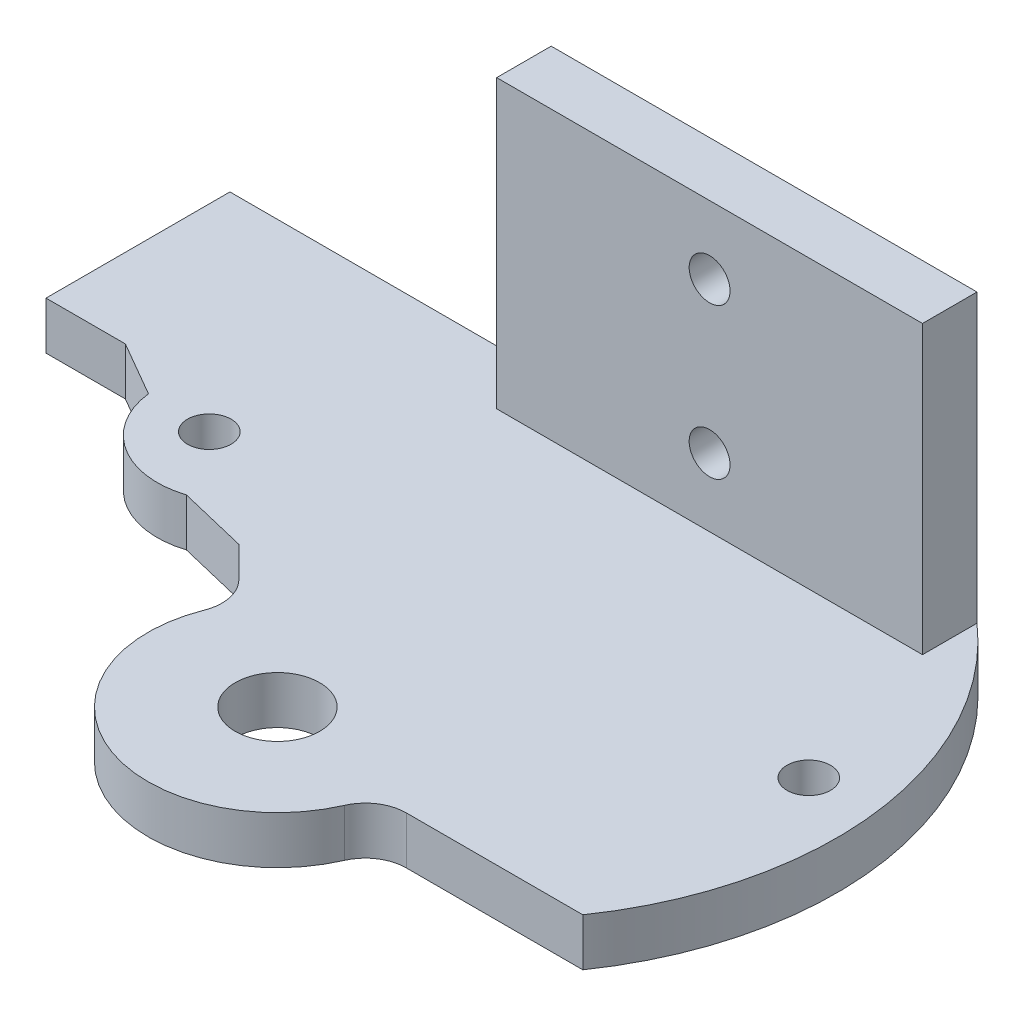
ISO-10303-21;
HEADER;
FILE_DESCRIPTION(('STEP AP214'),'2;1');
FILE_NAME('part.step','',(''),(''),'','','');
FILE_SCHEMA(('AUTOMOTIVE_DESIGN { 1 0 10303 214 1 1 1 1 }'));
ENDSEC;
DATA;
#1=APPLICATION_CONTEXT('core data for automotive mechanical design processes');
#2=APPLICATION_PROTOCOL_DEFINITION('international standard','automotive_design',2000,#1);
#3=PRODUCT_CONTEXT('',#1,'mechanical');
#4=PRODUCT('Part','Part','',(#3));
#5=PRODUCT_RELATED_PRODUCT_CATEGORY('part','',(#4));
#6=PRODUCT_DEFINITION_FORMATION('','',#4);
#7=PRODUCT_DEFINITION_CONTEXT('part definition',#1,'design');
#8=PRODUCT_DEFINITION('design','',#6,#7);
#9=PRODUCT_DEFINITION_SHAPE('','',#8);
#10=(LENGTH_UNIT() NAMED_UNIT(*) SI_UNIT(.MILLI.,.METRE.));
#11=(NAMED_UNIT(*) PLANE_ANGLE_UNIT() SI_UNIT($,.RADIAN.));
#12=(NAMED_UNIT(*) SI_UNIT($,.STERADIAN.) SOLID_ANGLE_UNIT());
#13=UNCERTAINTY_MEASURE_WITH_UNIT(LENGTH_MEASURE(1.E-05),#10,'distance_accuracy_value','');
#14=(GEOMETRIC_REPRESENTATION_CONTEXT(3) GLOBAL_UNCERTAINTY_ASSIGNED_CONTEXT((#13)) GLOBAL_UNIT_ASSIGNED_CONTEXT((#10,
#11,#12)) REPRESENTATION_CONTEXT('',''));
#15=CARTESIAN_POINT('',(0.,0.,0.));
#16=DIRECTION('',(0.,0.,1.));
#17=DIRECTION('',(1.,0.,0.));
#18=AXIS2_PLACEMENT_3D('',#15,#16,#17);
#19=CARTESIAN_POINT('',(20.3496,17.,-13.5));
#20=DIRECTION('',(0.,0.,1.));
#21=DIRECTION('',(1.,0.,0.));
#22=AXIS2_PLACEMENT_3D('',#19,#20,#21);
#23=PLANE('',#22);
#24=CARTESIAN_POINT('',(4.72198433686638,22.,-13.5));
#25=DIRECTION('',(0.,0.,1.));
#26=DIRECTION('',(1.,0.,0.));
#27=AXIS2_PLACEMENT_3D('',#24,#25,#26);
#28=CIRCLE('',#27,1.5);
#29=CARTESIAN_POINT('',(6.22198433686639,22.,-13.5));
#30=VERTEX_POINT('',#29);
#31=EDGE_CURVE('E342',#30,#30,#28,.T.);
#32=ORIENTED_EDGE('',*,*,#31,.T.);
#33=EDGE_LOOP('',(#32));
#34=FACE_BOUND('',#33,.T.);
#35=CARTESIAN_POINT('',(4.72198433686638,33.0559630595284,-13.5));
#36=DIRECTION('',(0.,0.,1.));
#37=DIRECTION('',(1.,0.,0.));
#38=AXIS2_PLACEMENT_3D('',#35,#36,#37);
#39=CIRCLE('',#38,1.5);
#40=CARTESIAN_POINT('',(6.22198433686638,33.0559630595284,-13.5));
#41=VERTEX_POINT('',#40);
#42=EDGE_CURVE('E299',#41,#41,#39,.T.);
#43=ORIENTED_EDGE('',*,*,#42,.T.);
#44=EDGE_LOOP('',(#43));
#45=FACE_BOUND('',#44,.T.);
#46=DIRECTION('',(1.,0.,0.));
#47=VECTOR('',#46,1.);
#48=CARTESIAN_POINT('',(20.3496,17.,-13.5));
#49=LINE('',#48,#47);
#50=CARTESIAN_POINT('',(-34.4868,17.,-13.5));
#51=VERTEX_POINT('',#50);
#52=CARTESIAN_POINT('',(-10.9056313262672,17.,-13.5));
#53=VERTEX_POINT('',#52);
#54=EDGE_CURVE('E346',#51,#53,#49,.T.);
#55=ORIENTED_EDGE('',*,*,#54,.T.);
#56=DIRECTION('',(0.,1.,0.));
#57=VECTOR('',#56,1.);
#58=CARTESIAN_POINT('',(-10.9056313262672,17.,-13.5));
#59=LINE('',#58,#57);
#60=CARTESIAN_POINT('',(-10.9056313262672,38.0559630595284,-13.5));
#61=VERTEX_POINT('',#60);
#62=EDGE_CURVE('E290',#53,#61,#59,.T.);
#63=ORIENTED_EDGE('',*,*,#62,.T.);
#64=DIRECTION('',(1.,0.,0.));
#65=VECTOR('',#64,1.);
#66=CARTESIAN_POINT('',(-34.4868,38.0559630595284,-13.5));
#67=LINE('',#66,#65);
#68=CARTESIAN_POINT('',(20.3496,38.0559630595284,-13.5));
#69=VERTEX_POINT('',#68);
#70=EDGE_CURVE('E266',#61,#69,#67,.T.);
#71=ORIENTED_EDGE('',*,*,#70,.T.);
#72=DIRECTION('',(0.,-1.,0.));
#73=VECTOR('',#72,1.);
#74=CARTESIAN_POINT('',(20.3496,38.0559630595284,-13.5));
#75=LINE('',#74,#73);
#76=CARTESIAN_POINT('',(20.3496,17.,-13.5));
#77=VERTEX_POINT('',#76);
#78=EDGE_CURVE('E301',#69,#77,#75,.T.);
#79=ORIENTED_EDGE('',*,*,#78,.T.);
#80=DIRECTION('',(0.,-1.,0.));
#81=VECTOR('',#80,1.);
#82=CARTESIAN_POINT('',(20.3496,17.,-13.5));
#83=LINE('',#82,#81);
#84=CARTESIAN_POINT('',(20.3496,13.5,-13.5));
#85=VERTEX_POINT('',#84);
#86=EDGE_CURVE('E164',#77,#85,#83,.T.);
#87=ORIENTED_EDGE('',*,*,#86,.T.);
#88=DIRECTION('',(-1.,0.,0.));
#89=VECTOR('',#88,1.);
#90=CARTESIAN_POINT('',(20.3496,13.5,-13.5));
#91=LINE('',#90,#89);
#92=CARTESIAN_POINT('',(-34.4868,13.5,-13.5));
#93=VERTEX_POINT('',#92);
#94=EDGE_CURVE('E165',#85,#93,#91,.T.);
#95=ORIENTED_EDGE('',*,*,#94,.T.);
#96=DIRECTION('',(0.,-1.,0.));
#97=VECTOR('',#96,1.);
#98=CARTESIAN_POINT('',(-34.4868,17.,-13.5));
#99=LINE('',#98,#97);
#100=EDGE_CURVE('E12',#51,#93,#99,.T.);
#101=ORIENTED_EDGE('',*,*,#100,.F.);
#102=EDGE_LOOP('',(#55,#63,#71,#79,#87,#95,#101));
#103=FACE_BOUND('',#102,.T.);
#104=ADVANCED_FACE('F36',(#34,#45,#103),#23,.F.);
#105=CARTESIAN_POINT('',(-34.4868,17.,-13.5));
#106=DIRECTION('',(1.,0.,0.));
#107=DIRECTION('',(0.,0.,-1.));
#108=AXIS2_PLACEMENT_3D('',#105,#106,#107);
#109=PLANE('',#108);
#110=DIRECTION('',(0.,0.,1.));
#111=VECTOR('',#110,1.);
#112=CARTESIAN_POINT('',(-34.4868,17.,-13.5));
#113=LINE('',#112,#111);
#114=CARTESIAN_POINT('',(-34.4868,17.,0.));
#115=VERTEX_POINT('',#114);
#116=EDGE_CURVE('E110',#51,#115,#113,.T.);
#117=ORIENTED_EDGE('',*,*,#116,.F.);
#118=ORIENTED_EDGE('',*,*,#100,.T.);
#119=DIRECTION('',(0.,0.,1.));
#120=VECTOR('',#119,1.);
#121=CARTESIAN_POINT('',(-34.4868,13.5,-13.5));
#122=LINE('',#121,#120);
#123=CARTESIAN_POINT('',(-34.4868,13.5,0.));
#124=VERTEX_POINT('',#123);
#125=EDGE_CURVE('E168',#93,#124,#122,.T.);
#126=ORIENTED_EDGE('',*,*,#125,.T.);
#127=DIRECTION('',(0.,-1.,0.));
#128=VECTOR('',#127,1.);
#129=CARTESIAN_POINT('',(-34.4868,17.,0.));
#130=LINE('',#129,#128);
#131=EDGE_CURVE('E46',#115,#124,#130,.T.);
#132=ORIENTED_EDGE('',*,*,#131,.F.);
#133=EDGE_LOOP('',(#117,#118,#126,#132));
#134=FACE_BOUND('',#133,.T.);
#135=ADVANCED_FACE('F332',(#134),#109,.F.);
#136=CARTESIAN_POINT('',(-34.4868,17.,0.));
#137=DIRECTION('',(0.,0.,-1.));
#138=DIRECTION('',(-1.,0.,0.));
#139=AXIS2_PLACEMENT_3D('',#136,#137,#138);
#140=PLANE('',#139);
#141=DIRECTION('',(1.,0.,0.));
#142=VECTOR('',#141,1.);
#143=CARTESIAN_POINT('',(-34.4868,13.5,0.));
#144=LINE('',#143,#142);
#145=CARTESIAN_POINT('',(-28.6613749786786,13.5,0.));
#146=VERTEX_POINT('',#145);
#147=EDGE_CURVE('E171',#124,#146,#144,.T.);
#148=ORIENTED_EDGE('',*,*,#147,.T.);
#149=DIRECTION('',(0.,-1.,0.));
#150=VECTOR('',#149,1.);
#151=CARTESIAN_POINT('',(-28.6613749786786,17.,0.));
#152=LINE('',#151,#150);
#153=CARTESIAN_POINT('',(-28.6613749786786,17.,0.));
#154=VERTEX_POINT('',#153);
#155=EDGE_CURVE('E205',#154,#146,#152,.T.);
#156=ORIENTED_EDGE('',*,*,#155,.F.);
#157=DIRECTION('',(1.,0.,0.));
#158=VECTOR('',#157,1.);
#159=CARTESIAN_POINT('',(-34.4868,17.,0.));
#160=LINE('',#159,#158);
#161=EDGE_CURVE('E221',#115,#154,#160,.T.);
#162=ORIENTED_EDGE('',*,*,#161,.F.);
#163=ORIENTED_EDGE('',*,*,#131,.T.);
#164=EDGE_LOOP('',(#148,#156,#162,#163));
#165=FACE_BOUND('',#164,.T.);
#166=ADVANCED_FACE('F337',(#165),#140,.F.);
#167=CARTESIAN_POINT('',(-28.6613749786786,17.,0.));
#168=DIRECTION('',(0.500442701800588,0.,-0.865769658866911));
#169=DIRECTION('',(-0.865769658866911,0.,-0.500442701800588));
#170=AXIS2_PLACEMENT_3D('',#167,#168,#169);
#171=PLANE('',#170);
#172=DIRECTION('',(0.865769658866911,0.,0.500442701800588));
#173=VECTOR('',#172,1.);
#174=CARTESIAN_POINT('',(-28.6613749786786,13.5,0.));
#175=LINE('',#174,#173);
#176=CARTESIAN_POINT('',(-24.6424002082218,13.5,2.32309664816397));
#177=VERTEX_POINT('',#176);
#178=EDGE_CURVE('E173',#146,#177,#175,.T.);
#179=ORIENTED_EDGE('',*,*,#178,.T.);
#180=DIRECTION('',(0.,-1.,0.));
#181=VECTOR('',#180,1.);
#182=CARTESIAN_POINT('',(-24.6424002082218,17.,2.32309664816397));
#183=LINE('',#182,#181);
#184=CARTESIAN_POINT('',(-24.6424002082218,17.,2.32309664816397));
#185=VERTEX_POINT('',#184);
#186=EDGE_CURVE('E202',#185,#177,#183,.T.);
#187=ORIENTED_EDGE('',*,*,#186,.F.);
#188=DIRECTION('',(0.865769658866911,0.,0.500442701800588));
#189=VECTOR('',#188,1.);
#190=CARTESIAN_POINT('',(-28.6613749786786,17.,0.));
#191=LINE('',#190,#189);
#192=EDGE_CURVE('E227',#154,#185,#191,.T.);
#193=ORIENTED_EDGE('',*,*,#192,.F.);
#194=ORIENTED_EDGE('',*,*,#155,.T.);
#195=EDGE_LOOP('',(#179,#187,#193,#194));
#196=FACE_BOUND('',#195,.T.);
#197=ADVANCED_FACE('F531',(#196),#171,.F.);
#198=CARTESIAN_POINT('',(-18.6805102122051,17.,1.64791691254111));
#199=DIRECTION('',(0.,-1.,0.));
#200=DIRECTION('',(0.,0.,-1.));
#201=AXIS2_PLACEMENT_3D('',#198,#199,#200);
#202=CYLINDRICAL_SURFACE('',#201,6.);
#203=CARTESIAN_POINT('',(-18.6805102122051,13.5,1.64791691254111));
#204=DIRECTION('',(0.,1.,0.));
#205=DIRECTION('',(0.,0.,1.));
#206=AXIS2_PLACEMENT_3D('',#203,#204,#205);
#207=CIRCLE('',#206,6.);
#208=CARTESIAN_POINT('',(-16.8299633080181,13.5,7.35540989592743));
#209=VERTEX_POINT('',#208);
#210=EDGE_CURVE('E175',#177,#209,#207,.T.);
#211=ORIENTED_EDGE('',*,*,#210,.T.);
#212=DIRECTION('',(0.,-1.,0.));
#213=VECTOR('',#212,1.);
#214=CARTESIAN_POINT('',(-16.8299633080181,17.,7.35540989592743));
#215=LINE('',#214,#213);
#216=CARTESIAN_POINT('',(-16.8299633080181,17.,7.35540989592743));
#217=VERTEX_POINT('',#216);
#218=EDGE_CURVE('E199',#217,#209,#215,.T.);
#219=ORIENTED_EDGE('',*,*,#218,.F.);
#220=CARTESIAN_POINT('',(-18.6805102122051,17.,1.64791691254111));
#221=DIRECTION('',(0.,1.,0.));
#222=DIRECTION('',(0.,0.,1.));
#223=AXIS2_PLACEMENT_3D('',#220,#221,#222);
#224=CIRCLE('',#223,6.);
#225=EDGE_CURVE('E229',#185,#217,#224,.T.);
#226=ORIENTED_EDGE('',*,*,#225,.F.);
#227=ORIENTED_EDGE('',*,*,#186,.T.);
#228=EDGE_LOOP('',(#211,#219,#226,#227));
#229=FACE_BOUND('',#228,.T.);
#230=ADVANCED_FACE('F522',(#229),#202,.T.);
#231=CARTESIAN_POINT('',(-16.8299633080181,17.,7.35540989592743));
#232=DIRECTION('',(0.233748216217537,0.,-0.972297162093524));
#233=DIRECTION('',(-0.972297162093524,0.,-0.233748216217537));
#234=AXIS2_PLACEMENT_3D('',#231,#232,#233);
#235=PLANE('',#234);
#236=DIRECTION('',(0.972297162093524,0.,0.233748216217537));
#237=VECTOR('',#236,1.);
#238=CARTESIAN_POINT('',(-16.8299633080181,13.5,7.35540989592743));
#239=LINE('',#238,#237);
#240=CARTESIAN_POINT('',(-11.7523069819295,13.5,8.57612014281668));
#241=VERTEX_POINT('',#240);
#242=EDGE_CURVE('E177',#209,#241,#239,.T.);
#243=ORIENTED_EDGE('',*,*,#242,.T.);
#244=DIRECTION('',(0.,-1.,0.));
#245=VECTOR('',#244,1.);
#246=CARTESIAN_POINT('',(-11.7523069819295,17.,8.57612014281668));
#247=LINE('',#246,#245);
#248=CARTESIAN_POINT('',(-11.7523069819295,17.,8.57612014281668));
#249=VERTEX_POINT('',#248);
#250=EDGE_CURVE('E196',#249,#241,#247,.T.);
#251=ORIENTED_EDGE('',*,*,#250,.F.);
#252=DIRECTION('',(0.972297162093524,0.,0.233748216217537));
#253=VECTOR('',#252,1.);
#254=CARTESIAN_POINT('',(-16.8299633080181,17.,7.35540989592743));
#255=LINE('',#254,#253);
#256=EDGE_CURVE('E231',#217,#249,#255,.T.);
#257=ORIENTED_EDGE('',*,*,#256,.F.);
#258=ORIENTED_EDGE('',*,*,#218,.T.);
#259=EDGE_LOOP('',(#243,#251,#257,#258));
#260=FACE_BOUND('',#259,.T.);
#261=ADVANCED_FACE('F514',(#260),#235,.F.);
#262=CARTESIAN_POINT('',(-11.7523069819295,17.,8.57612014281668));
#263=DIRECTION('',(0.707106781186547,0.,-0.707106781186548));
#264=DIRECTION('',(-0.707106781186548,0.,-0.707106781186547));
#265=AXIS2_PLACEMENT_3D('',#262,#263,#264);
#266=PLANE('',#265);
#267=DIRECTION('',(0.707106781186548,0.,0.707106781186547));
#268=VECTOR('',#267,1.);
#269=CARTESIAN_POINT('',(-11.7523069819295,13.5,8.57612014281668));
#270=LINE('',#269,#268);
#271=CARTESIAN_POINT('',(-9.51513943538292,13.5,10.8132876893633));
#272=VERTEX_POINT('',#271);
#273=EDGE_CURVE('E179',#241,#272,#270,.T.);
#274=ORIENTED_EDGE('',*,*,#273,.T.);
#275=DIRECTION('',(0.,-1.,0.));
#276=VECTOR('',#275,1.);
#277=CARTESIAN_POINT('',(-9.51513943538292,17.,10.8132876893633));
#278=LINE('',#277,#276);
#279=CARTESIAN_POINT('',(-9.51513943538292,17.,10.8132876893633));
#280=VERTEX_POINT('',#279);
#281=EDGE_CURVE('E193',#280,#272,#278,.T.);
#282=ORIENTED_EDGE('',*,*,#281,.F.);
#283=DIRECTION('',(0.707106781186548,0.,0.707106781186547));
#284=VECTOR('',#283,1.);
#285=CARTESIAN_POINT('',(-11.7523069819295,17.,8.57612014281668));
#286=LINE('',#285,#284);
#287=EDGE_CURVE('E233',#249,#280,#286,.T.);
#288=ORIENTED_EDGE('',*,*,#287,.F.);
#289=ORIENTED_EDGE('',*,*,#250,.T.);
#290=EDGE_LOOP('',(#274,#282,#288,#289));
#291=FACE_BOUND('',#290,.T.);
#292=ADVANCED_FACE('F239',(#291),#266,.F.);
#293=CARTESIAN_POINT('',(-11.6364597789426,17.,12.9346080329229));
#294=DIRECTION('',(0.,-1.,0.));
#295=DIRECTION('',(0.,0.,-1.));
#296=AXIS2_PLACEMENT_3D('',#293,#294,#295);
#297=CYLINDRICAL_SURFACE('',#296,3.);
#298=CARTESIAN_POINT('',(-11.6364597789426,13.5,12.9346080329229));
#299=DIRECTION('',(0.,-1.,0.));
#300=DIRECTION('',(0.,0.,1.));
#301=AXIS2_PLACEMENT_3D('',#298,#299,#300);
#302=CIRCLE('',#301,3.);
#303=CARTESIAN_POINT('',(-8.84370943199635,13.5,14.0303021050214));
#304=VERTEX_POINT('',#303);
#305=EDGE_CURVE('E181',#272,#304,#302,.T.);
#306=ORIENTED_EDGE('',*,*,#305,.T.);
#307=DIRECTION('',(0.,-1.,0.));
#308=VECTOR('',#307,1.);
#309=CARTESIAN_POINT('',(-8.84370943199635,17.,14.0303021050214));
#310=LINE('',#309,#308);
#311=CARTESIAN_POINT('',(-8.84370943199635,17.,14.0303021050214));
#312=VERTEX_POINT('',#311);
#313=EDGE_CURVE('E154',#312,#304,#310,.T.);
#314=ORIENTED_EDGE('',*,*,#313,.F.);
#315=CARTESIAN_POINT('',(-11.6364597789426,17.,12.9346080329229));
#316=DIRECTION('',(0.,-1.,0.));
#317=DIRECTION('',(0.,0.,1.));
#318=AXIS2_PLACEMENT_3D('',#315,#316,#317);
#319=CIRCLE('',#318,3.);
#320=EDGE_CURVE('E142',#280,#312,#319,.T.);
#321=ORIENTED_EDGE('',*,*,#320,.F.);
#322=ORIENTED_EDGE('',*,*,#281,.T.);
#323=EDGE_LOOP('',(#306,#314,#321,#322));
#324=FACE_BOUND('',#323,.T.);
#325=ADVANCED_FACE('F243',(#324),#297,.F.);
#326=CARTESIAN_POINT('',(0.,17.,17.5));
#327=DIRECTION('',(0.,-1.,0.));
#328=DIRECTION('',(0.,0.,-1.));
#329=AXIS2_PLACEMENT_3D('',#326,#327,#328);
#330=CYLINDRICAL_SURFACE('',#329,9.5);
#331=CARTESIAN_POINT('',(0.,13.5,17.5));
#332=DIRECTION('',(0.,1.,0.));
#333=DIRECTION('',(0.,0.,1.));
#334=AXIS2_PLACEMENT_3D('',#331,#332,#333);
#335=CIRCLE('',#334,9.5);
#336=CARTESIAN_POINT('',(8.7068938204161,13.5,21.3));
#337=VERTEX_POINT('',#336);
#338=EDGE_CURVE('E151',#304,#337,#335,.T.);
#339=ORIENTED_EDGE('',*,*,#338,.T.);
#340=DIRECTION('',(0.,-1.,0.));
#341=VECTOR('',#340,1.);
#342=CARTESIAN_POINT('',(8.7068938204161,17.,21.3));
#343=LINE('',#342,#341);
#344=CARTESIAN_POINT('',(8.7068938204161,17.,21.3));
#345=VERTEX_POINT('',#344);
#346=EDGE_CURVE('E148',#345,#337,#343,.T.);
#347=ORIENTED_EDGE('',*,*,#346,.F.);
#348=CARTESIAN_POINT('',(0.,17.,17.5));
#349=DIRECTION('',(0.,1.,0.));
#350=DIRECTION('',(0.,0.,1.));
#351=AXIS2_PLACEMENT_3D('',#348,#349,#350);
#352=CIRCLE('',#351,9.5);
#353=EDGE_CURVE('E133',#312,#345,#352,.T.);
#354=ORIENTED_EDGE('',*,*,#353,.F.);
#355=ORIENTED_EDGE('',*,*,#313,.T.);
#356=EDGE_LOOP('',(#339,#347,#354,#355));
#357=FACE_BOUND('',#356,.T.);
#358=ADVANCED_FACE('F149',(#357),#330,.T.);
#359=CARTESIAN_POINT('',(11.4564392373896,17.,22.5));
#360=DIRECTION('',(0.,-1.,0.));
#361=DIRECTION('',(0.,0.,-1.));
#362=AXIS2_PLACEMENT_3D('',#359,#360,#361);
#363=CYLINDRICAL_SURFACE('',#362,3.);
#364=CARTESIAN_POINT('',(11.4564392373896,13.5,22.5));
#365=DIRECTION('',(0.,-1.,0.));
#366=DIRECTION('',(0.,0.,1.));
#367=AXIS2_PLACEMENT_3D('',#364,#365,#366);
#368=CIRCLE('',#367,3.);
#369=CARTESIAN_POINT('',(11.4564392373896,13.5,19.5));
#370=VERTEX_POINT('',#369);
#371=EDGE_CURVE('E184',#337,#370,#368,.T.);
#372=ORIENTED_EDGE('',*,*,#371,.T.);
#373=DIRECTION('',(0.,-1.,0.));
#374=VECTOR('',#373,1.);
#375=CARTESIAN_POINT('',(11.4564392373896,17.,19.5));
#376=LINE('',#375,#374);
#377=CARTESIAN_POINT('',(11.4564392373896,17.,19.5));
#378=VERTEX_POINT('',#377);
#379=EDGE_CURVE('E155',#378,#370,#376,.T.);
#380=ORIENTED_EDGE('',*,*,#379,.F.);
#381=CARTESIAN_POINT('',(11.4564392373896,17.,22.5));
#382=DIRECTION('',(0.,-1.,0.));
#383=DIRECTION('',(0.,0.,1.));
#384=AXIS2_PLACEMENT_3D('',#381,#382,#383);
#385=CIRCLE('',#384,3.);
#386=EDGE_CURVE('E139',#345,#378,#385,.T.);
#387=ORIENTED_EDGE('',*,*,#386,.F.);
#388=ORIENTED_EDGE('',*,*,#346,.T.);
#389=EDGE_LOOP('',(#372,#380,#387,#388));
#390=FACE_BOUND('',#389,.T.);
#391=ADVANCED_FACE('F157',(#390),#363,.F.);
#392=CARTESIAN_POINT('',(11.4564392373896,17.,19.5));
#393=DIRECTION('',(0.,0.,-1.));
#394=DIRECTION('',(-1.,0.,0.));
#395=AXIS2_PLACEMENT_3D('',#392,#393,#394);
#396=PLANE('',#395);
#397=DIRECTION('',(1.,0.,0.));
#398=VECTOR('',#397,1.);
#399=CARTESIAN_POINT('',(11.4564392373896,13.5,19.5));
#400=LINE('',#399,#398);
#401=CARTESIAN_POINT('',(24.4182308941496,13.5,19.5));
#402=VERTEX_POINT('',#401);
#403=EDGE_CURVE('E95',#370,#402,#400,.T.);
#404=ORIENTED_EDGE('',*,*,#403,.T.);
#405=DIRECTION('',(0.,-1.,0.));
#406=VECTOR('',#405,1.);
#407=CARTESIAN_POINT('',(24.4182308941496,17.,19.5));
#408=LINE('',#407,#406);
#409=CARTESIAN_POINT('',(24.4182308941496,17.,19.5));
#410=VERTEX_POINT('',#409);
#411=EDGE_CURVE('E189',#410,#402,#408,.T.);
#412=ORIENTED_EDGE('',*,*,#411,.F.);
#413=DIRECTION('',(1.,0.,0.));
#414=VECTOR('',#413,1.);
#415=CARTESIAN_POINT('',(11.4564392373896,17.,19.5));
#416=LINE('',#415,#414);
#417=EDGE_CURVE('E55',#378,#410,#416,.T.);
#418=ORIENTED_EDGE('',*,*,#417,.F.);
#419=ORIENTED_EDGE('',*,*,#379,.T.);
#420=EDGE_LOOP('',(#404,#412,#418,#419));
#421=FACE_BOUND('',#420,.T.);
#422=ADVANCED_FACE('F247',(#421),#396,.F.);
#423=CARTESIAN_POINT('',(3.8530842496332,17.,5.28470037285398));
#424=DIRECTION('',(0.,-1.,0.));
#425=DIRECTION('',(0.,0.,-1.));
#426=AXIS2_PLACEMENT_3D('',#423,#424,#425);
#427=CYLINDRICAL_SURFACE('',#426,25.);
#428=CARTESIAN_POINT('',(3.8530842496332,13.5,5.28470037285398));
#429=DIRECTION('',(0.,1.,0.));
#430=DIRECTION('',(0.,0.,1.));
#431=AXIS2_PLACEMENT_3D('',#428,#429,#430);
#432=CIRCLE('',#431,25.);
#433=EDGE_CURVE('E102',#402,#85,#432,.T.);
#434=ORIENTED_EDGE('',*,*,#433,.T.);
#435=ORIENTED_EDGE('',*,*,#86,.F.);
#436=CARTESIAN_POINT('',(3.8530842496332,17.,5.28470037285398));
#437=DIRECTION('',(0.,1.,0.));
#438=DIRECTION('',(0.,0.,1.));
#439=AXIS2_PLACEMENT_3D('',#436,#437,#438);
#440=CIRCLE('',#439,25.);
#441=EDGE_CURVE('E159',#410,#77,#440,.T.);
#442=ORIENTED_EDGE('',*,*,#441,.F.);
#443=ORIENTED_EDGE('',*,*,#411,.T.);
#444=EDGE_LOOP('',(#434,#435,#442,#443));
#445=FACE_BOUND('',#444,.T.);
#446=ADVANCED_FACE('F249',(#445),#427,.T.);
#447=CARTESIAN_POINT('',(-18.6805102122051,17.,1.64791691254111));
#448=DIRECTION('',(0.,1.,0.));
#449=DIRECTION('',(0.,0.,1.));
#450=AXIS2_PLACEMENT_3D('',#447,#448,#449);
#451=PLANE('',#450);
#452=DIRECTION('',(0.,0.,-1.));
#453=VECTOR('',#452,1.);
#454=CARTESIAN_POINT('',(20.3496,17.,-9.49999999999999));
#455=LINE('',#454,#453);
#456=CARTESIAN_POINT('',(20.3496,17.,-9.49999999999999));
#457=VERTEX_POINT('',#456);
#458=EDGE_CURVE('E252',#457,#77,#455,.T.);
#459=ORIENTED_EDGE('',*,*,#458,.F.);
#460=DIRECTION('',(-1.,0.,0.));
#461=VECTOR('',#460,1.);
#462=CARTESIAN_POINT('',(20.3496,17.,-9.49999999999999));
#463=LINE('',#462,#461);
#464=CARTESIAN_POINT('',(-10.9056313262672,17.,-9.49999999999999));
#465=VERTEX_POINT('',#464);
#466=EDGE_CURVE('E39',#457,#465,#463,.T.);
#467=ORIENTED_EDGE('',*,*,#466,.T.);
#468=DIRECTION('',(0.,0.,1.));
#469=VECTOR('',#468,1.);
#470=CARTESIAN_POINT('',(-10.9056313262672,17.,-19.5));
#471=LINE('',#470,#469);
#472=EDGE_CURVE('E285',#53,#465,#471,.T.);
#473=ORIENTED_EDGE('',*,*,#472,.F.);
#474=ORIENTED_EDGE('',*,*,#54,.F.);
#475=ORIENTED_EDGE('',*,*,#116,.T.);
#476=ORIENTED_EDGE('',*,*,#161,.T.);
#477=ORIENTED_EDGE('',*,*,#192,.T.);
#478=ORIENTED_EDGE('',*,*,#225,.T.);
#479=ORIENTED_EDGE('',*,*,#256,.T.);
#480=ORIENTED_EDGE('',*,*,#287,.T.);
#481=ORIENTED_EDGE('',*,*,#320,.T.);
#482=ORIENTED_EDGE('',*,*,#353,.T.);
#483=ORIENTED_EDGE('',*,*,#386,.T.);
#484=ORIENTED_EDGE('',*,*,#417,.T.);
#485=ORIENTED_EDGE('',*,*,#441,.T.);
#486=EDGE_LOOP('',(#459,#467,#473,#474,#475,#476,#477,#478,#479,#480,#481,#482,#483,#484,#485));
#487=FACE_BOUND('',#486,.T.);
#488=CARTESIAN_POINT('',(0.,17.,17.5));
#489=DIRECTION('',(0.,1.,0.));
#490=DIRECTION('',(0.,0.,1.));
#491=AXIS2_PLACEMENT_3D('',#488,#489,#490);
#492=CIRCLE('',#491,3.1);
#493=CARTESIAN_POINT('',(0.,17.,20.6));
#494=VERTEX_POINT('',#493);
#495=EDGE_CURVE('E219',#494,#494,#492,.T.);
#496=ORIENTED_EDGE('',*,*,#495,.F.);
#497=EDGE_LOOP('',(#496));
#498=FACE_BOUND('',#497,.T.);
#499=CARTESIAN_POINT('',(-20.,17.,2.50000000000001));
#500=DIRECTION('',(0.,1.,0.));
#501=DIRECTION('',(0.,0.,1.));
#502=AXIS2_PLACEMENT_3D('',#499,#500,#501);
#503=CIRCLE('',#502,1.6);
#504=CARTESIAN_POINT('',(-20.,17.,4.10000000000001));
#505=VERTEX_POINT('',#504);
#506=EDGE_CURVE('E213',#505,#505,#503,.T.);
#507=ORIENTED_EDGE('',*,*,#506,.F.);
#508=EDGE_LOOP('',(#507));
#509=FACE_BOUND('',#508,.T.);
#510=CARTESIAN_POINT('',(24.,17.,2.50000000000001));
#511=DIRECTION('',(0.,1.,0.));
#512=DIRECTION('',(0.,0.,1.));
#513=AXIS2_PLACEMENT_3D('',#510,#511,#512);
#514=CIRCLE('',#513,1.6);
#515=CARTESIAN_POINT('',(24.,17.,4.10000000000001));
#516=VERTEX_POINT('',#515);
#517=EDGE_CURVE('E218',#516,#516,#514,.T.);
#518=ORIENTED_EDGE('',*,*,#517,.F.);
#519=EDGE_LOOP('',(#518));
#520=FACE_BOUND('',#519,.T.);
#521=ADVANCED_FACE('F136',(#487,#498,#509,#520),#451,.T.);
#522=CARTESIAN_POINT('',(-18.6805102122051,13.5,1.64791691254111));
#523=DIRECTION('',(0.,1.,0.));
#524=DIRECTION('',(0.,0.,1.));
#525=AXIS2_PLACEMENT_3D('',#522,#523,#524);
#526=PLANE('',#525);
#527=CARTESIAN_POINT('',(0.,13.5,17.5));
#528=DIRECTION('',(0.,1.,0.));
#529=DIRECTION('',(0.,0.,1.));
#530=AXIS2_PLACEMENT_3D('',#527,#528,#529);
#531=CIRCLE('',#530,3.1);
#532=CARTESIAN_POINT('',(0.,13.5,20.6));
#533=VERTEX_POINT('',#532);
#534=EDGE_CURVE('E216',#533,#533,#531,.T.);
#535=ORIENTED_EDGE('',*,*,#534,.T.);
#536=EDGE_LOOP('',(#535));
#537=FACE_BOUND('',#536,.T.);
#538=CARTESIAN_POINT('',(-20.,13.5,2.50000000000001));
#539=DIRECTION('',(0.,1.,0.));
#540=DIRECTION('',(0.,0.,1.));
#541=AXIS2_PLACEMENT_3D('',#538,#539,#540);
#542=CIRCLE('',#541,1.6);
#543=CARTESIAN_POINT('',(-20.,13.5,4.10000000000001));
#544=VERTEX_POINT('',#543);
#545=EDGE_CURVE('E169',#544,#544,#542,.T.);
#546=ORIENTED_EDGE('',*,*,#545,.T.);
#547=EDGE_LOOP('',(#546));
#548=FACE_BOUND('',#547,.T.);
#549=CARTESIAN_POINT('',(24.,13.5,2.50000000000001));
#550=DIRECTION('',(0.,1.,0.));
#551=DIRECTION('',(0.,0.,1.));
#552=AXIS2_PLACEMENT_3D('',#549,#550,#551);
#553=CIRCLE('',#552,1.6);
#554=CARTESIAN_POINT('',(24.,13.5,4.10000000000001));
#555=VERTEX_POINT('',#554);
#556=EDGE_CURVE('E210',#555,#555,#553,.T.);
#557=ORIENTED_EDGE('',*,*,#556,.T.);
#558=EDGE_LOOP('',(#557));
#559=FACE_BOUND('',#558,.T.);
#560=ORIENTED_EDGE('',*,*,#94,.F.);
#561=ORIENTED_EDGE('',*,*,#433,.F.);
#562=ORIENTED_EDGE('',*,*,#403,.F.);
#563=ORIENTED_EDGE('',*,*,#371,.F.);
#564=ORIENTED_EDGE('',*,*,#338,.F.);
#565=ORIENTED_EDGE('',*,*,#305,.F.);
#566=ORIENTED_EDGE('',*,*,#273,.F.);
#567=ORIENTED_EDGE('',*,*,#242,.F.);
#568=ORIENTED_EDGE('',*,*,#210,.F.);
#569=ORIENTED_EDGE('',*,*,#178,.F.);
#570=ORIENTED_EDGE('',*,*,#147,.F.);
#571=ORIENTED_EDGE('',*,*,#125,.F.);
#572=EDGE_LOOP('',(#560,#561,#562,#563,#564,#565,#566,#567,#568,#569,#570,#571));
#573=FACE_BOUND('',#572,.T.);
#574=ADVANCED_FACE('F246',(#537,#548,#559,#573),#526,.F.);
#575=CARTESIAN_POINT('',(24.,0.,2.50000000000001));
#576=DIRECTION('',(0.,1.,0.));
#577=DIRECTION('',(0.,0.,1.));
#578=AXIS2_PLACEMENT_3D('',#575,#576,#577);
#579=CYLINDRICAL_SURFACE('',#578,1.6);
#580=ORIENTED_EDGE('',*,*,#517,.T.);
#581=EDGE_LOOP('',(#580));
#582=FACE_BOUND('',#581,.T.);
#583=ORIENTED_EDGE('',*,*,#556,.F.);
#584=EDGE_LOOP('',(#583));
#585=FACE_BOUND('',#584,.T.);
#586=ADVANCED_FACE('F318',(#582,#585),#579,.F.);
#587=CARTESIAN_POINT('',(-20.,0.,2.50000000000001));
#588=DIRECTION('',(0.,1.,0.));
#589=DIRECTION('',(0.,0.,1.));
#590=AXIS2_PLACEMENT_3D('',#587,#588,#589);
#591=CYLINDRICAL_SURFACE('',#590,1.6);
#592=ORIENTED_EDGE('',*,*,#506,.T.);
#593=EDGE_LOOP('',(#592));
#594=FACE_BOUND('',#593,.T.);
#595=ORIENTED_EDGE('',*,*,#545,.F.);
#596=EDGE_LOOP('',(#595));
#597=FACE_BOUND('',#596,.T.);
#598=ADVANCED_FACE('F368',(#594,#597),#591,.F.);
#599=CARTESIAN_POINT('',(0.,12.,17.5));
#600=DIRECTION('',(0.,1.,0.));
#601=DIRECTION('',(0.,0.,1.));
#602=AXIS2_PLACEMENT_3D('',#599,#600,#601);
#603=CYLINDRICAL_SURFACE('',#602,3.1);
#604=ORIENTED_EDGE('',*,*,#495,.T.);
#605=EDGE_LOOP('',(#604));
#606=FACE_BOUND('',#605,.T.);
#607=ORIENTED_EDGE('',*,*,#534,.F.);
#608=EDGE_LOOP('',(#607));
#609=FACE_BOUND('',#608,.T.);
#610=ADVANCED_FACE('F363',(#606,#609),#603,.F.);
#611=CARTESIAN_POINT('',(20.3496,38.0559630595284,-9.49999999999999));
#612=DIRECTION('',(1.,0.,0.));
#613=DIRECTION('',(0.,1.,0.));
#614=AXIS2_PLACEMENT_3D('',#611,#612,#613);
#615=PLANE('',#614);
#616=ORIENTED_EDGE('',*,*,#78,.F.);
#617=DIRECTION('',(0.,0.,-1.));
#618=VECTOR('',#617,1.);
#619=CARTESIAN_POINT('',(20.3496,38.0559630595284,-9.49999999999999));
#620=LINE('',#619,#618);
#621=CARTESIAN_POINT('',(20.3496,38.0559630595284,-9.49999999999999));
#622=VERTEX_POINT('',#621);
#623=EDGE_CURVE('E309',#622,#69,#620,.T.);
#624=ORIENTED_EDGE('',*,*,#623,.F.);
#625=DIRECTION('',(0.,-1.,0.));
#626=VECTOR('',#625,1.);
#627=CARTESIAN_POINT('',(20.3496,38.0559630595284,-9.49999999999999));
#628=LINE('',#627,#626);
#629=EDGE_CURVE('E302',#622,#457,#628,.T.);
#630=ORIENTED_EDGE('',*,*,#629,.T.);
#631=ORIENTED_EDGE('',*,*,#458,.T.);
#632=EDGE_LOOP('',(#616,#624,#630,#631));
#633=FACE_BOUND('',#632,.T.);
#634=ADVANCED_FACE('F352',(#633),#615,.T.);
#635=CARTESIAN_POINT('',(-34.4868,38.0559630595284,-9.49999999999999));
#636=DIRECTION('',(0.,1.,0.));
#637=DIRECTION('',(0.,0.,1.));
#638=AXIS2_PLACEMENT_3D('',#635,#636,#637);
#639=PLANE('',#638);
#640=DIRECTION('',(0.,0.,1.));
#641=VECTOR('',#640,1.);
#642=CARTESIAN_POINT('',(-10.9056313262672,38.0559630595284,-19.5));
#643=LINE('',#642,#641);
#644=CARTESIAN_POINT('',(-10.9056313262672,38.0559630595284,-9.49999999999999));
#645=VERTEX_POINT('',#644);
#646=EDGE_CURVE('E292',#61,#645,#643,.T.);
#647=ORIENTED_EDGE('',*,*,#646,.T.);
#648=DIRECTION('',(1.,0.,0.));
#649=VECTOR('',#648,1.);
#650=CARTESIAN_POINT('',(-34.4868,38.0559630595284,-9.49999999999999));
#651=LINE('',#650,#649);
#652=EDGE_CURVE('E298',#645,#622,#651,.T.);
#653=ORIENTED_EDGE('',*,*,#652,.T.);
#654=ORIENTED_EDGE('',*,*,#623,.T.);
#655=ORIENTED_EDGE('',*,*,#70,.F.);
#656=EDGE_LOOP('',(#647,#653,#654,#655));
#657=FACE_BOUND('',#656,.T.);
#658=ADVANCED_FACE('F354',(#657),#639,.T.);
#659=CARTESIAN_POINT('',(0.,0.,-9.49999999999999));
#660=DIRECTION('',(0.,0.,-1.));
#661=DIRECTION('',(-1.,0.,0.));
#662=AXIS2_PLACEMENT_3D('',#659,#660,#661);
#663=PLANE('',#662);
#664=CARTESIAN_POINT('',(4.72198433686638,22.,-9.49999999999999));
#665=DIRECTION('',(0.,0.,1.));
#666=DIRECTION('',(1.,0.,0.));
#667=AXIS2_PLACEMENT_3D('',#664,#665,#666);
#668=CIRCLE('',#667,1.5);
#669=CARTESIAN_POINT('',(6.22198433686639,22.,-9.49999999999999));
#670=VERTEX_POINT('',#669);
#671=EDGE_CURVE('E455',#670,#670,#668,.T.);
#672=ORIENTED_EDGE('',*,*,#671,.F.);
#673=EDGE_LOOP('',(#672));
#674=FACE_BOUND('',#673,.T.);
#675=CARTESIAN_POINT('',(4.72198433686638,33.0559630595284,-9.49999999999999));
#676=DIRECTION('',(0.,0.,1.));
#677=DIRECTION('',(1.,0.,0.));
#678=AXIS2_PLACEMENT_3D('',#675,#676,#677);
#679=CIRCLE('',#678,1.5);
#680=CARTESIAN_POINT('',(6.22198433686638,33.0559630595284,-9.49999999999999));
#681=VERTEX_POINT('',#680);
#682=EDGE_CURVE('E456',#681,#681,#679,.T.);
#683=ORIENTED_EDGE('',*,*,#682,.F.);
#684=EDGE_LOOP('',(#683));
#685=FACE_BOUND('',#684,.T.);
#686=ORIENTED_EDGE('',*,*,#652,.F.);
#687=DIRECTION('',(0.,1.,0.));
#688=VECTOR('',#687,1.);
#689=CARTESIAN_POINT('',(-10.9056313262672,38.0559630595284,-9.49999999999999));
#690=LINE('',#689,#688);
#691=EDGE_CURVE('E288',#465,#645,#690,.T.);
#692=ORIENTED_EDGE('',*,*,#691,.F.);
#693=ORIENTED_EDGE('',*,*,#466,.F.);
#694=ORIENTED_EDGE('',*,*,#629,.F.);
#695=EDGE_LOOP('',(#686,#692,#693,#694));
#696=FACE_BOUND('',#695,.T.);
#697=ADVANCED_FACE('F296',(#674,#685,#696),#663,.F.);
#698=CARTESIAN_POINT('',(-10.9056313262672,38.0559630595284,-19.5));
#699=DIRECTION('',(1.,0.,0.));
#700=DIRECTION('',(0.,0.,-1.));
#701=AXIS2_PLACEMENT_3D('',#698,#699,#700);
#702=PLANE('',#701);
#703=ORIENTED_EDGE('',*,*,#472,.T.);
#704=ORIENTED_EDGE('',*,*,#691,.T.);
#705=ORIENTED_EDGE('',*,*,#646,.F.);
#706=ORIENTED_EDGE('',*,*,#62,.F.);
#707=EDGE_LOOP('',(#703,#704,#705,#706));
#708=FACE_BOUND('',#707,.T.);
#709=ADVANCED_FACE('F287',(#708),#702,.F.);
#710=CARTESIAN_POINT('',(4.72198433686638,33.0559630595284,-19.5));
#711=DIRECTION('',(0.,0.,1.));
#712=DIRECTION('',(1.,0.,0.));
#713=AXIS2_PLACEMENT_3D('',#710,#711,#712);
#714=CYLINDRICAL_SURFACE('',#713,1.5);
#715=ORIENTED_EDGE('',*,*,#682,.T.);
#716=EDGE_LOOP('',(#715));
#717=FACE_BOUND('',#716,.T.);
#718=ORIENTED_EDGE('',*,*,#42,.F.);
#719=EDGE_LOOP('',(#718));
#720=FACE_BOUND('',#719,.T.);
#721=ADVANCED_FACE('F419',(#717,#720),#714,.F.);
#722=CARTESIAN_POINT('',(4.72198433686638,22.,-19.5));
#723=DIRECTION('',(0.,0.,1.));
#724=DIRECTION('',(1.,0.,0.));
#725=AXIS2_PLACEMENT_3D('',#722,#723,#724);
#726=CYLINDRICAL_SURFACE('',#725,1.5);
#727=ORIENTED_EDGE('',*,*,#671,.T.);
#728=EDGE_LOOP('',(#727));
#729=FACE_BOUND('',#728,.T.);
#730=ORIENTED_EDGE('',*,*,#31,.F.);
#731=EDGE_LOOP('',(#730));
#732=FACE_BOUND('',#731,.T.);
#733=ADVANCED_FACE('F438',(#729,#732),#726,.F.);
#734=CLOSED_SHELL('',(#104,#135,#166,#197,#230,#261,#292,#325,#358,#391,#422,#446,#521,#574,
#586,#598,#610,#634,#658,#697,#709,#721,#733));
#735=MANIFOLD_SOLID_BREP('B2',#734);
#736=ADVANCED_BREP_SHAPE_REPRESENTATION('',(#18,#735),#14);
#737=SHAPE_DEFINITION_REPRESENTATION(#9,#736);
ENDSEC;
END-ISO-10303-21;
